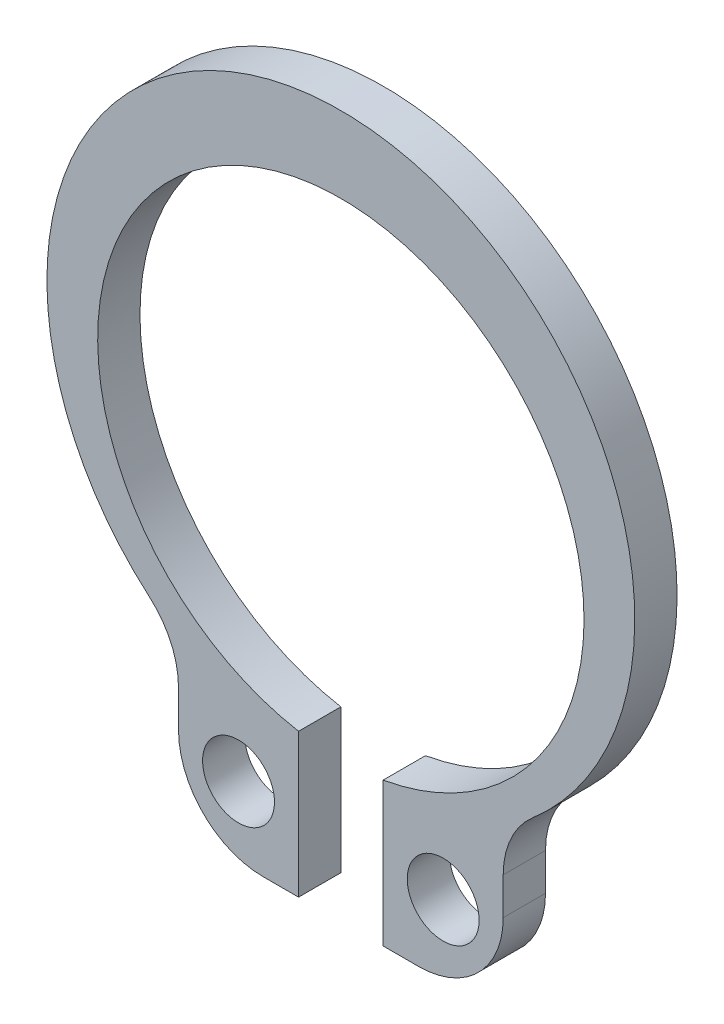
ISO-10303-21;
HEADER;
FILE_DESCRIPTION(('STEP AP214'),'2;1');
FILE_NAME('part.step','',(''),(''),'','','');
FILE_SCHEMA(('AUTOMOTIVE_DESIGN { 1 0 10303 214 1 1 1 1 }'));
ENDSEC;
DATA;
#1=APPLICATION_CONTEXT('core data for automotive mechanical design processes');
#2=APPLICATION_PROTOCOL_DEFINITION('international standard','automotive_design',2000,#1);
#3=PRODUCT_CONTEXT('',#1,'mechanical');
#4=PRODUCT('Part','Part','',(#3));
#5=PRODUCT_RELATED_PRODUCT_CATEGORY('part','',(#4));
#6=PRODUCT_DEFINITION_FORMATION('','',#4);
#7=PRODUCT_DEFINITION_CONTEXT('part definition',#1,'design');
#8=PRODUCT_DEFINITION('design','',#6,#7);
#9=PRODUCT_DEFINITION_SHAPE('','',#8);
#10=(LENGTH_UNIT() NAMED_UNIT(*) SI_UNIT(.MILLI.,.METRE.));
#11=(NAMED_UNIT(*) PLANE_ANGLE_UNIT() SI_UNIT($,.RADIAN.));
#12=(NAMED_UNIT(*) SI_UNIT($,.STERADIAN.) SOLID_ANGLE_UNIT());
#13=UNCERTAINTY_MEASURE_WITH_UNIT(LENGTH_MEASURE(1.E-05),#10,'distance_accuracy_value','');
#14=(GEOMETRIC_REPRESENTATION_CONTEXT(3) GLOBAL_UNCERTAINTY_ASSIGNED_CONTEXT((#13)) GLOBAL_UNIT_ASSIGNED_CONTEXT((#10,
#11,#12)) REPRESENTATION_CONTEXT('',''));
#15=CARTESIAN_POINT('',(0.,0.,0.));
#16=DIRECTION('',(0.,0.,1.));
#17=DIRECTION('',(1.,0.,0.));
#18=AXIS2_PLACEMENT_3D('',#15,#16,#17);
#19=CARTESIAN_POINT('',(-5.83914123253891,-6.18284082567651,1.));
#20=DIRECTION('',(0.,0.,-1.));
#21=DIRECTION('',(-1.,0.,0.));
#22=AXIS2_PLACEMENT_3D('',#19,#20,#21);
#23=CYLINDRICAL_SURFACE('',#22,2.);
#24=CARTESIAN_POINT('',(-5.83914123253891,-6.18284082567651,0.));
#25=DIRECTION('',(0.,0.,1.));
#26=DIRECTION('',(0.,1.,0.));
#27=AXIS2_PLACEMENT_3D('',#24,#25,#26);
#28=CIRCLE('',#27,2.);
#29=CARTESIAN_POINT('',(-3.83914123253891,-6.18284082567651,0.));
#30=VERTEX_POINT('',#29);
#31=CARTESIAN_POINT('',(-4.53430520292127,-4.66712220541361,0.));
#32=VERTEX_POINT('',#31);
#33=EDGE_CURVE('E124',#30,#32,#28,.T.);
#34=ORIENTED_EDGE('',*,*,#33,.F.);
#35=DIRECTION('',(0.,0.,-1.));
#36=VECTOR('',#35,1.);
#37=CARTESIAN_POINT('',(-3.83914123253891,-6.18284082567651,1.));
#38=LINE('',#37,#36);
#39=CARTESIAN_POINT('',(-3.83914123253891,-6.18284082567651,1.));
#40=VERTEX_POINT('',#39);
#41=EDGE_CURVE('E29',#40,#30,#38,.T.);
#42=ORIENTED_EDGE('',*,*,#41,.F.);
#43=CARTESIAN_POINT('',(-5.83914123253891,-6.18284082567651,1.));
#44=DIRECTION('',(0.,0.,1.));
#45=DIRECTION('',(0.,1.,0.));
#46=AXIS2_PLACEMENT_3D('',#43,#44,#45);
#47=CIRCLE('',#46,2.);
#48=CARTESIAN_POINT('',(-4.53430520292127,-4.66712220541361,1.));
#49=VERTEX_POINT('',#48);
#50=EDGE_CURVE('E154',#40,#49,#47,.T.);
#51=ORIENTED_EDGE('',*,*,#50,.T.);
#52=DIRECTION('',(0.,0.,-1.));
#53=VECTOR('',#52,1.);
#54=CARTESIAN_POINT('',(-4.53430520292127,-4.66712220541361,1.));
#55=LINE('',#54,#53);
#56=EDGE_CURVE('E10',#49,#32,#55,.T.);
#57=ORIENTED_EDGE('',*,*,#56,.T.);
#58=EDGE_LOOP('',(#34,#42,#51,#57));
#59=FACE_BOUND('',#58,.T.);
#60=ADVANCED_FACE('F15',(#59),#23,.F.);
#61=CARTESIAN_POINT('',(0.,0.6,1.));
#62=DIRECTION('',(0.,0.,-1.));
#63=DIRECTION('',(-1.,0.,0.));
#64=AXIS2_PLACEMENT_3D('',#61,#62,#63);
#65=CYLINDRICAL_SURFACE('',#64,6.95);
#66=CARTESIAN_POINT('',(0.,0.6,0.));
#67=DIRECTION('',(0.,0.,1.));
#68=DIRECTION('',(0.,1.,0.));
#69=AXIS2_PLACEMENT_3D('',#66,#67,#68);
#70=CIRCLE('',#69,6.95);
#71=CARTESIAN_POINT('',(4.53430520292127,-4.66712220541361,0.));
#72=VERTEX_POINT('',#71);
#73=EDGE_CURVE('E106',#72,#32,#70,.T.);
#74=ORIENTED_EDGE('',*,*,#73,.T.);
#75=ORIENTED_EDGE('',*,*,#56,.F.);
#76=CARTESIAN_POINT('',(0.,0.6,1.));
#77=DIRECTION('',(0.,0.,1.));
#78=DIRECTION('',(0.,1.,0.));
#79=AXIS2_PLACEMENT_3D('',#76,#77,#78);
#80=CIRCLE('',#79,6.95);
#81=CARTESIAN_POINT('',(4.53430520292127,-4.66712220541361,1.));
#82=VERTEX_POINT('',#81);
#83=EDGE_CURVE('E109',#82,#49,#80,.T.);
#84=ORIENTED_EDGE('',*,*,#83,.F.);
#85=DIRECTION('',(0.,0.,-1.));
#86=VECTOR('',#85,1.);
#87=CARTESIAN_POINT('',(4.53430520292127,-4.66712220541361,1.));
#88=LINE('',#87,#86);
#89=EDGE_CURVE('E18',#82,#72,#88,.T.);
#90=ORIENTED_EDGE('',*,*,#89,.T.);
#91=EDGE_LOOP('',(#74,#75,#84,#90));
#92=FACE_BOUND('',#91,.T.);
#93=ADVANCED_FACE('F104',(#92),#65,.T.);
#94=CARTESIAN_POINT('',(5.83914123253891,-6.18284082567652,1.));
#95=DIRECTION('',(0.,0.,-1.));
#96=DIRECTION('',(-1.,0.,0.));
#97=AXIS2_PLACEMENT_3D('',#94,#95,#96);
#98=CYLINDRICAL_SURFACE('',#97,2.);
#99=CARTESIAN_POINT('',(5.83914123253891,-6.18284082567652,0.));
#100=DIRECTION('',(0.,0.,1.));
#101=DIRECTION('',(0.,1.,0.));
#102=AXIS2_PLACEMENT_3D('',#99,#100,#101);
#103=CIRCLE('',#102,2.);
#104=CARTESIAN_POINT('',(3.8391412325389,-6.18284082567652,0.));
#105=VERTEX_POINT('',#104);
#106=EDGE_CURVE('E115',#72,#105,#103,.T.);
#107=ORIENTED_EDGE('',*,*,#106,.F.);
#108=ORIENTED_EDGE('',*,*,#89,.F.);
#109=CARTESIAN_POINT('',(5.83914123253891,-6.18284082567652,1.));
#110=DIRECTION('',(0.,0.,1.));
#111=DIRECTION('',(0.,1.,0.));
#112=AXIS2_PLACEMENT_3D('',#109,#110,#111);
#113=CIRCLE('',#112,2.);
#114=CARTESIAN_POINT('',(3.8391412325389,-6.18284082567652,1.));
#115=VERTEX_POINT('',#114);
#116=EDGE_CURVE('E157',#82,#115,#113,.T.);
#117=ORIENTED_EDGE('',*,*,#116,.T.);
#118=DIRECTION('',(0.,0.,-1.));
#119=VECTOR('',#118,1.);
#120=CARTESIAN_POINT('',(3.8391412325389,-6.18284082567652,1.));
#121=LINE('',#120,#119);
#122=EDGE_CURVE('E113',#115,#105,#121,.T.);
#123=ORIENTED_EDGE('',*,*,#122,.T.);
#124=EDGE_LOOP('',(#107,#108,#117,#123));
#125=FACE_BOUND('',#124,.T.);
#126=ADVANCED_FACE('F116',(#125),#98,.F.);
#127=CARTESIAN_POINT('',(3.8391412325389,-7.06,1.));
#128=DIRECTION('',(-1.,0.,0.));
#129=DIRECTION('',(0.,-1.,0.));
#130=AXIS2_PLACEMENT_3D('',#127,#128,#129);
#131=PLANE('',#130);
#132=DIRECTION('',(0.,1.,0.));
#133=VECTOR('',#132,1.);
#134=CARTESIAN_POINT('',(3.8391412325389,-7.06,0.));
#135=LINE('',#134,#133);
#136=CARTESIAN_POINT('',(3.8391412325389,-7.06,0.));
#137=VERTEX_POINT('',#136);
#138=EDGE_CURVE('E120',#137,#105,#135,.T.);
#139=ORIENTED_EDGE('',*,*,#138,.T.);
#140=ORIENTED_EDGE('',*,*,#122,.F.);
#141=DIRECTION('',(0.,1.,0.));
#142=VECTOR('',#141,1.);
#143=CARTESIAN_POINT('',(3.8391412325389,-7.06,1.));
#144=LINE('',#143,#142);
#145=CARTESIAN_POINT('',(3.8391412325389,-7.06,1.));
#146=VERTEX_POINT('',#145);
#147=EDGE_CURVE('E159',#146,#115,#144,.T.);
#148=ORIENTED_EDGE('',*,*,#147,.F.);
#149=DIRECTION('',(0.,0.,-1.));
#150=VECTOR('',#149,1.);
#151=CARTESIAN_POINT('',(3.8391412325389,-7.06,1.));
#152=LINE('',#151,#150);
#153=EDGE_CURVE('E201',#146,#137,#152,.T.);
#154=ORIENTED_EDGE('',*,*,#153,.T.);
#155=EDGE_LOOP('',(#139,#140,#148,#154));
#156=FACE_BOUND('',#155,.T.);
#157=ADVANCED_FACE('F205',(#156),#131,.F.);
#158=CARTESIAN_POINT('',(1.83914123253891,-7.06,1.));
#159=DIRECTION('',(0.,0.,-1.));
#160=DIRECTION('',(-1.,0.,0.));
#161=AXIS2_PLACEMENT_3D('',#158,#159,#160);
#162=CYLINDRICAL_SURFACE('',#161,2.);
#163=CARTESIAN_POINT('',(1.83914123253891,-7.06,0.));
#164=DIRECTION('',(0.,0.,1.));
#165=DIRECTION('',(0.,1.,0.));
#166=AXIS2_PLACEMENT_3D('',#163,#164,#165);
#167=CIRCLE('',#166,2.);
#168=CARTESIAN_POINT('',(1.83914123253891,-9.06,0.));
#169=VERTEX_POINT('',#168);
#170=EDGE_CURVE('E132',#169,#137,#167,.T.);
#171=ORIENTED_EDGE('',*,*,#170,.T.);
#172=ORIENTED_EDGE('',*,*,#153,.F.);
#173=CARTESIAN_POINT('',(1.83914123253891,-7.06,1.));
#174=DIRECTION('',(0.,0.,1.));
#175=DIRECTION('',(0.,1.,0.));
#176=AXIS2_PLACEMENT_3D('',#173,#174,#175);
#177=CIRCLE('',#176,2.);
#178=CARTESIAN_POINT('',(1.83914123253891,-9.06,1.));
#179=VERTEX_POINT('',#178);
#180=EDGE_CURVE('E162',#179,#146,#177,.T.);
#181=ORIENTED_EDGE('',*,*,#180,.F.);
#182=DIRECTION('',(0.,0.,-1.));
#183=VECTOR('',#182,1.);
#184=CARTESIAN_POINT('',(1.83914123253891,-9.06,1.));
#185=LINE('',#184,#183);
#186=EDGE_CURVE('E199',#179,#169,#185,.T.);
#187=ORIENTED_EDGE('',*,*,#186,.T.);
#188=EDGE_LOOP('',(#171,#172,#181,#187));
#189=FACE_BOUND('',#188,.T.);
#190=ADVANCED_FACE('F209',(#189),#162,.T.);
#191=CARTESIAN_POINT('',(1.,-9.06,1.));
#192=DIRECTION('',(0.,1.,0.));
#193=DIRECTION('',(-1.,0.,0.));
#194=AXIS2_PLACEMENT_3D('',#191,#192,#193);
#195=PLANE('',#194);
#196=DIRECTION('',(1.,0.,0.));
#197=VECTOR('',#196,1.);
#198=CARTESIAN_POINT('',(1.,-9.06,0.));
#199=LINE('',#198,#197);
#200=CARTESIAN_POINT('',(1.,-9.06,0.));
#201=VERTEX_POINT('',#200);
#202=EDGE_CURVE('E135',#201,#169,#199,.T.);
#203=ORIENTED_EDGE('',*,*,#202,.T.);
#204=ORIENTED_EDGE('',*,*,#186,.F.);
#205=DIRECTION('',(1.,0.,0.));
#206=VECTOR('',#205,1.);
#207=CARTESIAN_POINT('',(1.,-9.06,1.));
#208=LINE('',#207,#206);
#209=CARTESIAN_POINT('',(1.,-9.06,1.));
#210=VERTEX_POINT('',#209);
#211=EDGE_CURVE('E165',#210,#179,#208,.T.);
#212=ORIENTED_EDGE('',*,*,#211,.F.);
#213=DIRECTION('',(0.,0.,-1.));
#214=VECTOR('',#213,1.);
#215=CARTESIAN_POINT('',(1.,-9.06,1.));
#216=LINE('',#215,#214);
#217=EDGE_CURVE('E197',#210,#201,#216,.T.);
#218=ORIENTED_EDGE('',*,*,#217,.T.);
#219=EDGE_LOOP('',(#203,#204,#212,#218));
#220=FACE_BOUND('',#219,.T.);
#221=ADVANCED_FACE('F213',(#220),#195,.F.);
#222=CARTESIAN_POINT('',(1.,-9.06,1.));
#223=DIRECTION('',(-1.,0.,0.));
#224=DIRECTION('',(0.,-1.,0.));
#225=AXIS2_PLACEMENT_3D('',#222,#223,#224);
#226=PLANE('',#225);
#227=DIRECTION('',(0.,1.,0.));
#228=VECTOR('',#227,1.);
#229=CARTESIAN_POINT('',(1.,-9.06,0.));
#230=LINE('',#229,#228);
#231=CARTESIAN_POINT('',(1.,-5.66237582645306,0.));
#232=VERTEX_POINT('',#231);
#233=EDGE_CURVE('E138',#201,#232,#230,.T.);
#234=ORIENTED_EDGE('',*,*,#233,.F.);
#235=ORIENTED_EDGE('',*,*,#217,.F.);
#236=DIRECTION('',(0.,1.,0.));
#237=VECTOR('',#236,1.);
#238=CARTESIAN_POINT('',(1.,-9.06,1.));
#239=LINE('',#238,#237);
#240=CARTESIAN_POINT('',(1.,-5.66237582645306,1.));
#241=VERTEX_POINT('',#240);
#242=EDGE_CURVE('E168',#210,#241,#239,.T.);
#243=ORIENTED_EDGE('',*,*,#242,.T.);
#244=DIRECTION('',(0.,0.,-1.));
#245=VECTOR('',#244,1.);
#246=CARTESIAN_POINT('',(1.,-5.66237582645306,1.));
#247=LINE('',#246,#245);
#248=EDGE_CURVE('E195',#241,#232,#247,.T.);
#249=ORIENTED_EDGE('',*,*,#248,.T.);
#250=EDGE_LOOP('',(#234,#235,#243,#249));
#251=FACE_BOUND('',#250,.T.);
#252=ADVANCED_FACE('F217',(#251),#226,.T.);
#253=CARTESIAN_POINT('',(0.,0.,1.));
#254=DIRECTION('',(0.,0.,-1.));
#255=DIRECTION('',(-1.,0.,0.));
#256=AXIS2_PLACEMENT_3D('',#253,#254,#255);
#257=CYLINDRICAL_SURFACE('',#256,5.75);
#258=CARTESIAN_POINT('',(0.,0.,0.));
#259=DIRECTION('',(0.,0.,1.));
#260=DIRECTION('',(0.,1.,0.));
#261=AXIS2_PLACEMENT_3D('',#258,#259,#260);
#262=CIRCLE('',#261,5.75);
#263=CARTESIAN_POINT('',(-1.,-5.66237582645306,0.));
#264=VERTEX_POINT('',#263);
#265=EDGE_CURVE('E141',#232,#264,#262,.T.);
#266=ORIENTED_EDGE('',*,*,#265,.F.);
#267=ORIENTED_EDGE('',*,*,#248,.F.);
#268=CARTESIAN_POINT('',(0.,0.,1.));
#269=DIRECTION('',(0.,0.,1.));
#270=DIRECTION('',(0.,1.,0.));
#271=AXIS2_PLACEMENT_3D('',#268,#269,#270);
#272=CIRCLE('',#271,5.75);
#273=CARTESIAN_POINT('',(-1.,-5.66237582645306,1.));
#274=VERTEX_POINT('',#273);
#275=EDGE_CURVE('E171',#241,#274,#272,.T.);
#276=ORIENTED_EDGE('',*,*,#275,.T.);
#277=DIRECTION('',(0.,0.,-1.));
#278=VECTOR('',#277,1.);
#279=CARTESIAN_POINT('',(-1.,-5.66237582645306,1.));
#280=LINE('',#279,#278);
#281=EDGE_CURVE('E193',#274,#264,#280,.T.);
#282=ORIENTED_EDGE('',*,*,#281,.T.);
#283=EDGE_LOOP('',(#266,#267,#276,#282));
#284=FACE_BOUND('',#283,.T.);
#285=ADVANCED_FACE('F221',(#284),#257,.F.);
#286=CARTESIAN_POINT('',(-1.,-9.06,1.));
#287=DIRECTION('',(-1.,0.,0.));
#288=DIRECTION('',(0.,-1.,0.));
#289=AXIS2_PLACEMENT_3D('',#286,#287,#288);
#290=PLANE('',#289);
#291=DIRECTION('',(0.,1.,0.));
#292=VECTOR('',#291,1.);
#293=CARTESIAN_POINT('',(-1.,-9.06,0.));
#294=LINE('',#293,#292);
#295=CARTESIAN_POINT('',(-1.,-9.06,0.));
#296=VERTEX_POINT('',#295);
#297=EDGE_CURVE('E144',#296,#264,#294,.T.);
#298=ORIENTED_EDGE('',*,*,#297,.T.);
#299=ORIENTED_EDGE('',*,*,#281,.F.);
#300=DIRECTION('',(0.,1.,0.));
#301=VECTOR('',#300,1.);
#302=CARTESIAN_POINT('',(-1.,-9.06,1.));
#303=LINE('',#302,#301);
#304=CARTESIAN_POINT('',(-1.,-9.06,1.));
#305=VERTEX_POINT('',#304);
#306=EDGE_CURVE('E174',#305,#274,#303,.T.);
#307=ORIENTED_EDGE('',*,*,#306,.F.);
#308=DIRECTION('',(0.,0.,-1.));
#309=VECTOR('',#308,1.);
#310=CARTESIAN_POINT('',(-1.,-9.06,1.));
#311=LINE('',#310,#309);
#312=EDGE_CURVE('E191',#305,#296,#311,.T.);
#313=ORIENTED_EDGE('',*,*,#312,.T.);
#314=EDGE_LOOP('',(#298,#299,#307,#313));
#315=FACE_BOUND('',#314,.T.);
#316=ADVANCED_FACE('F226',(#315),#290,.F.);
#317=CARTESIAN_POINT('',(-1.83914123253892,-9.06,1.));
#318=DIRECTION('',(0.,1.,0.));
#319=DIRECTION('',(-1.,0.,0.));
#320=AXIS2_PLACEMENT_3D('',#317,#318,#319);
#321=PLANE('',#320);
#322=DIRECTION('',(1.,0.,0.));
#323=VECTOR('',#322,1.);
#324=CARTESIAN_POINT('',(-1.83914123253892,-9.06,0.));
#325=LINE('',#324,#323);
#326=CARTESIAN_POINT('',(-1.83914123253892,-9.06,0.));
#327=VERTEX_POINT('',#326);
#328=EDGE_CURVE('E147',#327,#296,#325,.T.);
#329=ORIENTED_EDGE('',*,*,#328,.T.);
#330=ORIENTED_EDGE('',*,*,#312,.F.);
#331=DIRECTION('',(1.,0.,0.));
#332=VECTOR('',#331,1.);
#333=CARTESIAN_POINT('',(-1.83914123253892,-9.06,1.));
#334=LINE('',#333,#332);
#335=CARTESIAN_POINT('',(-1.83914123253892,-9.06,1.));
#336=VERTEX_POINT('',#335);
#337=EDGE_CURVE('E177',#336,#305,#334,.T.);
#338=ORIENTED_EDGE('',*,*,#337,.F.);
#339=DIRECTION('',(0.,0.,-1.));
#340=VECTOR('',#339,1.);
#341=CARTESIAN_POINT('',(-1.83914123253892,-9.06,1.));
#342=LINE('',#341,#340);
#343=EDGE_CURVE('E189',#336,#327,#342,.T.);
#344=ORIENTED_EDGE('',*,*,#343,.T.);
#345=EDGE_LOOP('',(#329,#330,#338,#344));
#346=FACE_BOUND('',#345,.T.);
#347=ADVANCED_FACE('F230',(#346),#321,.F.);
#348=CARTESIAN_POINT('',(-1.83914123253892,-7.06,1.));
#349=DIRECTION('',(0.,0.,-1.));
#350=DIRECTION('',(-1.,0.,0.));
#351=AXIS2_PLACEMENT_3D('',#348,#349,#350);
#352=CYLINDRICAL_SURFACE('',#351,2.);
#353=CARTESIAN_POINT('',(-1.83914123253892,-7.06,0.));
#354=DIRECTION('',(0.,0.,1.));
#355=DIRECTION('',(0.,1.,0.));
#356=AXIS2_PLACEMENT_3D('',#353,#354,#355);
#357=CIRCLE('',#356,2.);
#358=CARTESIAN_POINT('',(-3.83914123253891,-7.06,0.));
#359=VERTEX_POINT('',#358);
#360=EDGE_CURVE('E150',#359,#327,#357,.T.);
#361=ORIENTED_EDGE('',*,*,#360,.T.);
#362=ORIENTED_EDGE('',*,*,#343,.F.);
#363=CARTESIAN_POINT('',(-1.83914123253892,-7.06,1.));
#364=DIRECTION('',(0.,0.,1.));
#365=DIRECTION('',(0.,1.,0.));
#366=AXIS2_PLACEMENT_3D('',#363,#364,#365);
#367=CIRCLE('',#366,2.);
#368=CARTESIAN_POINT('',(-3.83914123253891,-7.06,1.));
#369=VERTEX_POINT('',#368);
#370=EDGE_CURVE('E180',#369,#336,#367,.T.);
#371=ORIENTED_EDGE('',*,*,#370,.F.);
#372=DIRECTION('',(0.,0.,-1.));
#373=VECTOR('',#372,1.);
#374=CARTESIAN_POINT('',(-3.83914123253891,-7.06,1.));
#375=LINE('',#374,#373);
#376=EDGE_CURVE('E36',#369,#359,#375,.T.);
#377=ORIENTED_EDGE('',*,*,#376,.T.);
#378=EDGE_LOOP('',(#361,#362,#371,#377));
#379=FACE_BOUND('',#378,.T.);
#380=ADVANCED_FACE('F232',(#379),#352,.T.);
#381=CARTESIAN_POINT('',(-3.83914123253891,-6.18284082567651,1.));
#382=DIRECTION('',(1.,0.,0.));
#383=DIRECTION('',(0.,1.,0.));
#384=AXIS2_PLACEMENT_3D('',#381,#382,#383);
#385=PLANE('',#384);
#386=DIRECTION('',(0.,-1.,0.));
#387=VECTOR('',#386,1.);
#388=CARTESIAN_POINT('',(-3.83914123253891,-6.18284082567651,0.));
#389=LINE('',#388,#387);
#390=EDGE_CURVE('E153',#30,#359,#389,.T.);
#391=ORIENTED_EDGE('',*,*,#390,.T.);
#392=ORIENTED_EDGE('',*,*,#376,.F.);
#393=DIRECTION('',(0.,-1.,0.));
#394=VECTOR('',#393,1.);
#395=CARTESIAN_POINT('',(-3.83914123253891,-6.18284082567651,1.));
#396=LINE('',#395,#394);
#397=EDGE_CURVE('E183',#40,#369,#396,.T.);
#398=ORIENTED_EDGE('',*,*,#397,.F.);
#399=ORIENTED_EDGE('',*,*,#41,.T.);
#400=EDGE_LOOP('',(#391,#392,#398,#399));
#401=FACE_BOUND('',#400,.T.);
#402=ADVANCED_FACE('F236',(#401),#385,.F.);
#403=CARTESIAN_POINT('',(-5.83914123253891,-6.18284082567651,1.));
#404=DIRECTION('',(0.,0.,1.));
#405=DIRECTION('',(1.,0.,0.));
#406=AXIS2_PLACEMENT_3D('',#403,#404,#405);
#407=PLANE('',#406);
#408=CARTESIAN_POINT('',(-2.41957061626945,-7.4,1.));
#409=DIRECTION('',(0.,0.,-1.));
#410=DIRECTION('',(0.,1.,0.));
#411=AXIS2_PLACEMENT_3D('',#408,#409,#410);
#412=CIRCLE('',#411,0.85);
#413=CARTESIAN_POINT('',(-2.41957061626945,-6.55,1.));
#414=VERTEX_POINT('',#413);
#415=EDGE_CURVE('E346',#414,#414,#412,.T.);
#416=ORIENTED_EDGE('',*,*,#415,.T.);
#417=EDGE_LOOP('',(#416));
#418=FACE_BOUND('',#417,.T.);
#419=CARTESIAN_POINT('',(2.41957061626945,-7.4,1.));
#420=DIRECTION('',(0.,0.,-1.));
#421=DIRECTION('',(0.,1.,0.));
#422=AXIS2_PLACEMENT_3D('',#419,#420,#421);
#423=CIRCLE('',#422,0.85);
#424=CARTESIAN_POINT('',(2.41957061626945,-6.55,1.));
#425=VERTEX_POINT('',#424);
#426=EDGE_CURVE('E126',#425,#425,#423,.T.);
#427=ORIENTED_EDGE('',*,*,#426,.T.);
#428=EDGE_LOOP('',(#427));
#429=FACE_BOUND('',#428,.T.);
#430=ORIENTED_EDGE('',*,*,#50,.F.);
#431=ORIENTED_EDGE('',*,*,#397,.T.);
#432=ORIENTED_EDGE('',*,*,#370,.T.);
#433=ORIENTED_EDGE('',*,*,#337,.T.);
#434=ORIENTED_EDGE('',*,*,#306,.T.);
#435=ORIENTED_EDGE('',*,*,#275,.F.);
#436=ORIENTED_EDGE('',*,*,#242,.F.);
#437=ORIENTED_EDGE('',*,*,#211,.T.);
#438=ORIENTED_EDGE('',*,*,#180,.T.);
#439=ORIENTED_EDGE('',*,*,#147,.T.);
#440=ORIENTED_EDGE('',*,*,#116,.F.);
#441=ORIENTED_EDGE('',*,*,#83,.T.);
#442=EDGE_LOOP('',(#430,#431,#432,#433,#434,#435,#436,#437,#438,#439,#440,#441));
#443=FACE_BOUND('',#442,.T.);
#444=ADVANCED_FACE('F235',(#418,#429,#443),#407,.T.);
#445=CARTESIAN_POINT('',(-5.83914123253891,-6.18284082567651,0.));
#446=DIRECTION('',(0.,0.,1.));
#447=DIRECTION('',(1.,0.,0.));
#448=AXIS2_PLACEMENT_3D('',#445,#446,#447);
#449=PLANE('',#448);
#450=CARTESIAN_POINT('',(-2.41957061626945,-7.4,0.));
#451=DIRECTION('',(0.,0.,1.));
#452=DIRECTION('',(0.,1.,0.));
#453=AXIS2_PLACEMENT_3D('',#450,#451,#452);
#454=CIRCLE('',#453,0.85);
#455=CARTESIAN_POINT('',(-2.41957061626945,-6.55,0.));
#456=VERTEX_POINT('',#455);
#457=EDGE_CURVE('E349',#456,#456,#454,.T.);
#458=ORIENTED_EDGE('',*,*,#457,.T.);
#459=EDGE_LOOP('',(#458));
#460=FACE_BOUND('',#459,.T.);
#461=CARTESIAN_POINT('',(2.41957061626945,-7.4,0.));
#462=DIRECTION('',(0.,0.,1.));
#463=DIRECTION('',(0.,1.,0.));
#464=AXIS2_PLACEMENT_3D('',#461,#462,#463);
#465=CIRCLE('',#464,0.85);
#466=CARTESIAN_POINT('',(2.41957061626945,-6.55,0.));
#467=VERTEX_POINT('',#466);
#468=EDGE_CURVE('E351',#467,#467,#465,.T.);
#469=ORIENTED_EDGE('',*,*,#468,.T.);
#470=EDGE_LOOP('',(#469));
#471=FACE_BOUND('',#470,.T.);
#472=ORIENTED_EDGE('',*,*,#33,.T.);
#473=ORIENTED_EDGE('',*,*,#73,.F.);
#474=ORIENTED_EDGE('',*,*,#106,.T.);
#475=ORIENTED_EDGE('',*,*,#138,.F.);
#476=ORIENTED_EDGE('',*,*,#170,.F.);
#477=ORIENTED_EDGE('',*,*,#202,.F.);
#478=ORIENTED_EDGE('',*,*,#233,.T.);
#479=ORIENTED_EDGE('',*,*,#265,.T.);
#480=ORIENTED_EDGE('',*,*,#297,.F.);
#481=ORIENTED_EDGE('',*,*,#328,.F.);
#482=ORIENTED_EDGE('',*,*,#360,.F.);
#483=ORIENTED_EDGE('',*,*,#390,.F.);
#484=EDGE_LOOP('',(#472,#473,#474,#475,#476,#477,#478,#479,#480,#481,#482,#483));
#485=FACE_BOUND('',#484,.T.);
#486=ADVANCED_FACE('F122',(#460,#471,#485),#449,.F.);
#487=CARTESIAN_POINT('',(2.41957061626945,-7.4,0.));
#488=DIRECTION('',(0.,0.,1.));
#489=DIRECTION('',(0.,1.,0.));
#490=AXIS2_PLACEMENT_3D('',#487,#488,#489);
#491=CYLINDRICAL_SURFACE('',#490,0.85);
#492=ORIENTED_EDGE('',*,*,#426,.F.);
#493=EDGE_LOOP('',(#492));
#494=FACE_BOUND('',#493,.T.);
#495=ORIENTED_EDGE('',*,*,#468,.F.);
#496=EDGE_LOOP('',(#495));
#497=FACE_BOUND('',#496,.T.);
#498=ADVANCED_FACE('F325',(#494,#497),#491,.F.);
#499=CARTESIAN_POINT('',(-2.41957061626945,-7.4,0.));
#500=DIRECTION('',(0.,0.,1.));
#501=DIRECTION('',(0.,1.,0.));
#502=AXIS2_PLACEMENT_3D('',#499,#500,#501);
#503=CYLINDRICAL_SURFACE('',#502,0.85);
#504=ORIENTED_EDGE('',*,*,#415,.F.);
#505=EDGE_LOOP('',(#504));
#506=FACE_BOUND('',#505,.T.);
#507=ORIENTED_EDGE('',*,*,#457,.F.);
#508=EDGE_LOOP('',(#507));
#509=FACE_BOUND('',#508,.T.);
#510=ADVANCED_FACE('F333',(#506,#509),#503,.F.);
#511=CLOSED_SHELL('',(#60,#93,#126,#157,#190,#221,#252,#285,#316,#347,#380,#402,#444,#486,#498,#510));
#512=MANIFOLD_SOLID_BREP('B1',#511);
#513=ADVANCED_BREP_SHAPE_REPRESENTATION('',(#18,#512),#14);
#514=SHAPE_DEFINITION_REPRESENTATION(#9,#513);
ENDSEC;
END-ISO-10303-21;
